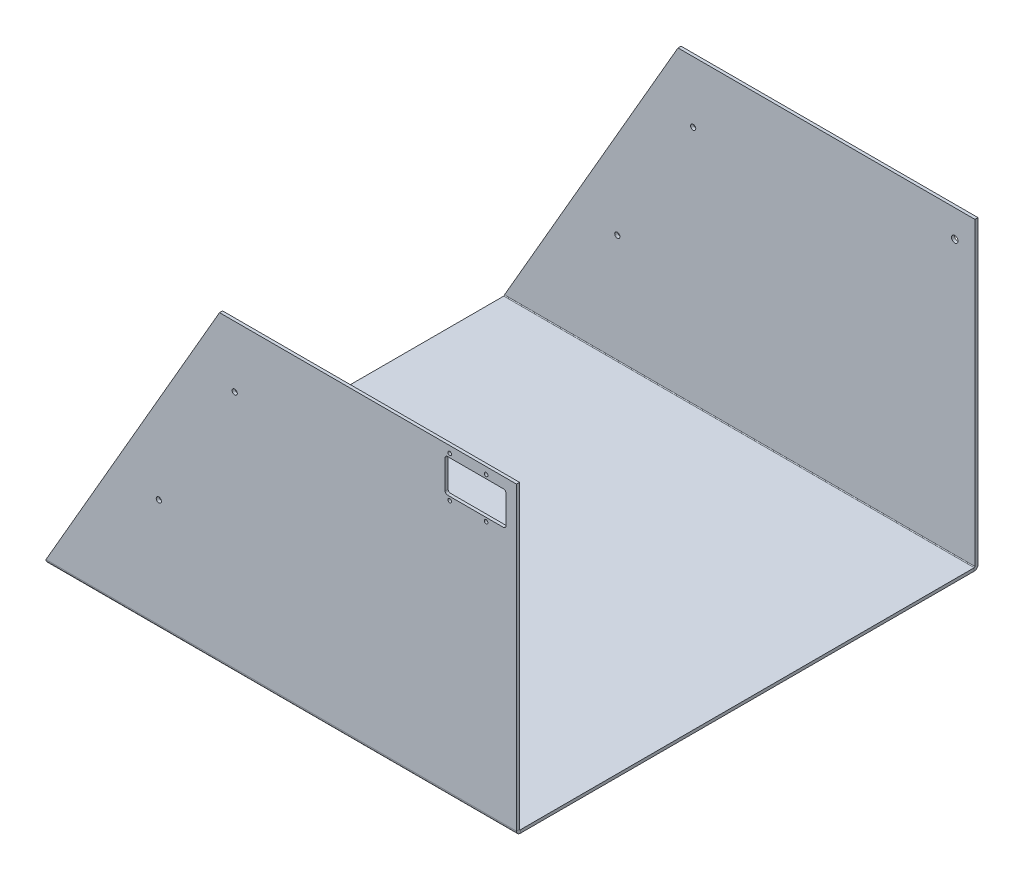
ISO-10303-21;
HEADER;
FILE_DESCRIPTION(('STEP AP214'),'2;1');
FILE_NAME('part.step','',(''),(''),'','','');
FILE_SCHEMA(('AUTOMOTIVE_DESIGN { 1 0 10303 214 1 1 1 1 }'));
ENDSEC;
DATA;
#1=APPLICATION_CONTEXT('core data for automotive mechanical design processes');
#2=APPLICATION_PROTOCOL_DEFINITION('international standard','automotive_design',2000,#1);
#3=PRODUCT_CONTEXT('',#1,'mechanical');
#4=PRODUCT('Part','Part','',(#3));
#5=PRODUCT_RELATED_PRODUCT_CATEGORY('part','',(#4));
#6=PRODUCT_DEFINITION_FORMATION('','',#4);
#7=PRODUCT_DEFINITION_CONTEXT('part definition',#1,'design');
#8=PRODUCT_DEFINITION('design','',#6,#7);
#9=PRODUCT_DEFINITION_SHAPE('','',#8);
#10=(LENGTH_UNIT() NAMED_UNIT(*) SI_UNIT(.MILLI.,.METRE.));
#11=(NAMED_UNIT(*) PLANE_ANGLE_UNIT() SI_UNIT($,.RADIAN.));
#12=(NAMED_UNIT(*) SI_UNIT($,.STERADIAN.) SOLID_ANGLE_UNIT());
#13=UNCERTAINTY_MEASURE_WITH_UNIT(LENGTH_MEASURE(1.E-05),#10,'distance_accuracy_value','');
#14=(GEOMETRIC_REPRESENTATION_CONTEXT(3) GLOBAL_UNCERTAINTY_ASSIGNED_CONTEXT((#13)) GLOBAL_UNIT_ASSIGNED_CONTEXT((#10,
#11,#12)) REPRESENTATION_CONTEXT('',''));
#15=CARTESIAN_POINT('',(0.,0.,0.));
#16=DIRECTION('',(0.,0.,1.));
#17=DIRECTION('',(1.,0.,0.));
#18=AXIS2_PLACEMENT_3D('',#15,#16,#17);
#19=CARTESIAN_POINT('',(0.,0.,-304.));
#20=DIRECTION('',(0.,0.,-1.));
#21=DIRECTION('',(-1.,0.,0.));
#22=AXIS2_PLACEMENT_3D('',#19,#20,#21);
#23=PLANE('',#22);
#24=CARTESIAN_POINT('',(-185.604770824935,157.726646048197,-304.));
#25=DIRECTION('',(0.,0.,-1.));
#26=DIRECTION('',(-1.,0.,0.));
#27=AXIS2_PLACEMENT_3D('',#24,#25,#26);
#28=CIRCLE('',#27,1.69999999999998);
#29=CARTESIAN_POINT('',(-187.304770824935,157.726646048197,-304.));
#30=VERTEX_POINT('',#29);
#31=EDGE_CURVE('E556',#30,#30,#28,.T.);
#32=ORIENTED_EDGE('',*,*,#31,.F.);
#33=EDGE_LOOP('',(#32));
#34=FACE_BOUND('',#33,.T.);
#35=CARTESIAN_POINT('',(-13.3,179.98217021338,-304.));
#36=DIRECTION('',(0.,0.,-1.));
#37=DIRECTION('',(-1.,0.,0.));
#38=AXIS2_PLACEMENT_3D('',#35,#36,#37);
#39=CIRCLE('',#38,2.14999999999999);
#40=CARTESIAN_POINT('',(-15.45,179.98217021338,-304.));
#41=VERTEX_POINT('',#40);
#42=EDGE_CURVE('E550',#41,#41,#39,.T.);
#43=ORIENTED_EDGE('',*,*,#42,.F.);
#44=EDGE_LOOP('',(#43));
#45=FACE_BOUND('',#44,.T.);
#46=CARTESIAN_POINT('',(-235.596855298411,71.1378157638619,-304.));
#47=DIRECTION('',(0.,0.,-1.));
#48=DIRECTION('',(-1.,0.,0.));
#49=AXIS2_PLACEMENT_3D('',#46,#47,#48);
#50=CIRCLE('',#49,1.69999999999998);
#51=CARTESIAN_POINT('',(-237.296855298411,71.1378157638619,-304.));
#52=VERTEX_POINT('',#51);
#53=EDGE_CURVE('E398',#52,#52,#50,.T.);
#54=ORIENTED_EDGE('',*,*,#53,.F.);
#55=EDGE_LOOP('',(#54));
#56=FACE_BOUND('',#55,.T.);
#57=DIRECTION('',(-1.,0.,0.));
#58=VECTOR('',#57,1.);
#59=CARTESIAN_POINT('',(0.,-1.04074594803853E-12,-304.));
#60=LINE('',#59,#58);
#61=CARTESIAN_POINT('',(0.,-1.05820335473276E-12,-304.));
#62=VERTEX_POINT('',#61);
#63=CARTESIAN_POINT('',(-309.908043231795,0.,-304.));
#64=VERTEX_POINT('',#63);
#65=EDGE_CURVE('E219',#62,#64,#60,.T.);
#66=ORIENTED_EDGE('',*,*,#65,.T.);
#67=DIRECTION('',(-0.500000000000004,-0.866025403784436,0.));
#68=VECTOR('',#67,1.);
#69=CARTESIAN_POINT('',(-309.908043231795,0.,-304.));
#70=LINE('',#69,#68);
#71=CARTESIAN_POINT('',(-195.602983964352,197.982170213382,-304.));
#72=VERTEX_POINT('',#71);
#73=EDGE_CURVE('E201',#72,#64,#70,.T.);
#74=ORIENTED_EDGE('',*,*,#73,.F.);
#75=DIRECTION('',(-1.,0.,0.));
#76=VECTOR('',#75,1.);
#77=CARTESIAN_POINT('',(0.,197.98217021338,-304.));
#78=LINE('',#77,#76);
#79=CARTESIAN_POINT('',(0.,197.98217021338,-304.));
#80=VERTEX_POINT('',#79);
#81=EDGE_CURVE('E211',#80,#72,#78,.T.);
#82=ORIENTED_EDGE('',*,*,#81,.F.);
#83=DIRECTION('',(0.,1.,0.));
#84=VECTOR('',#83,1.);
#85=CARTESIAN_POINT('',(0.,269.499999999999,-304.));
#86=LINE('',#85,#84);
#87=EDGE_CURVE('E235',#62,#80,#86,.T.);
#88=ORIENTED_EDGE('',*,*,#87,.F.);
#89=EDGE_LOOP('',(#66,#74,#82,#88));
#90=FACE_BOUND('',#89,.T.);
#91=ADVANCED_FACE('F60',(#34,#45,#56,#90),#23,.T.);
#92=CARTESIAN_POINT('',(0.,0.,-302.));
#93=DIRECTION('',(0.,0.,-1.));
#94=DIRECTION('',(-1.,0.,0.));
#95=AXIS2_PLACEMENT_3D('',#92,#93,#94);
#96=PLANE('',#95);
#97=CARTESIAN_POINT('',(-185.604770824935,157.726646048197,-302.));
#98=DIRECTION('',(0.,0.,-1.));
#99=DIRECTION('',(-1.,0.,0.));
#100=AXIS2_PLACEMENT_3D('',#97,#98,#99);
#101=CIRCLE('',#100,1.69999999999999);
#102=CARTESIAN_POINT('',(-187.304770824935,157.726646048197,-302.));
#103=VERTEX_POINT('',#102);
#104=EDGE_CURVE('E553',#103,#103,#101,.T.);
#105=ORIENTED_EDGE('',*,*,#104,.T.);
#106=EDGE_LOOP('',(#105));
#107=FACE_BOUND('',#106,.T.);
#108=CARTESIAN_POINT('',(-13.3,179.98217021338,-302.));
#109=DIRECTION('',(0.,0.,-1.));
#110=DIRECTION('',(-1.,0.,0.));
#111=AXIS2_PLACEMENT_3D('',#108,#109,#110);
#112=CIRCLE('',#111,2.14999999999999);
#113=CARTESIAN_POINT('',(-15.45,179.98217021338,-302.));
#114=VERTEX_POINT('',#113);
#115=EDGE_CURVE('E547',#114,#114,#112,.T.);
#116=ORIENTED_EDGE('',*,*,#115,.T.);
#117=EDGE_LOOP('',(#116));
#118=FACE_BOUND('',#117,.T.);
#119=CARTESIAN_POINT('',(-235.596855298411,71.1378157638619,-302.));
#120=DIRECTION('',(0.,0.,-1.));
#121=DIRECTION('',(-1.,0.,0.));
#122=AXIS2_PLACEMENT_3D('',#119,#120,#121);
#123=CIRCLE('',#122,1.69999999999999);
#124=CARTESIAN_POINT('',(-237.296855298411,71.1378157638619,-302.));
#125=VERTEX_POINT('',#124);
#126=EDGE_CURVE('E226',#125,#125,#123,.T.);
#127=ORIENTED_EDGE('',*,*,#126,.T.);
#128=EDGE_LOOP('',(#127));
#129=FACE_BOUND('',#128,.T.);
#130=DIRECTION('',(-0.500000000000004,-0.866025403784436,0.));
#131=VECTOR('',#130,1.);
#132=CARTESIAN_POINT('',(-309.908043231795,0.,-302.));
#133=LINE('',#132,#131);
#134=CARTESIAN_POINT('',(-195.602983964352,197.982170213382,-302.));
#135=VERTEX_POINT('',#134);
#136=CARTESIAN_POINT('',(-309.908043231795,0.,-302.));
#137=VERTEX_POINT('',#136);
#138=EDGE_CURVE('E204',#135,#137,#133,.T.);
#139=ORIENTED_EDGE('',*,*,#138,.T.);
#140=DIRECTION('',(-1.,0.,0.));
#141=VECTOR('',#140,1.);
#142=CARTESIAN_POINT('',(0.,-1.0547118733939E-12,-302.));
#143=LINE('',#142,#141);
#144=CARTESIAN_POINT('',(0.,-1.05820335473276E-12,-302.));
#145=VERTEX_POINT('',#144);
#146=EDGE_CURVE('E207',#145,#137,#143,.T.);
#147=ORIENTED_EDGE('',*,*,#146,.F.);
#148=DIRECTION('',(0.,1.,0.));
#149=VECTOR('',#148,1.);
#150=CARTESIAN_POINT('',(0.,269.499999999999,-302.));
#151=LINE('',#150,#149);
#152=CARTESIAN_POINT('',(0.,197.98217021338,-302.));
#153=VERTEX_POINT('',#152);
#154=EDGE_CURVE('E234',#145,#153,#151,.T.);
#155=ORIENTED_EDGE('',*,*,#154,.T.);
#156=DIRECTION('',(-1.,0.,0.));
#157=VECTOR('',#156,1.);
#158=CARTESIAN_POINT('',(0.,197.98217021338,-302.));
#159=LINE('',#158,#157);
#160=EDGE_CURVE('E224',#153,#135,#159,.T.);
#161=ORIENTED_EDGE('',*,*,#160,.T.);
#162=EDGE_LOOP('',(#139,#147,#155,#161));
#163=FACE_BOUND('',#162,.T.);
#164=ADVANCED_FACE('F403',(#107,#118,#129,#163),#96,.F.);
#165=CARTESIAN_POINT('',(-309.908043231795,-2.50000000000108,-302.));
#166=DIRECTION('',(1.,0.,0.));
#167=DIRECTION('',(0.,1.,0.));
#168=AXIS2_PLACEMENT_3D('',#165,#166,#167);
#169=PLANE('',#168);
#170=DIRECTION('',(0.,-1.,0.));
#171=VECTOR('',#170,1.);
#172=CARTESIAN_POINT('',(-309.908043231795,-0.500000000001114,-301.5));
#173=LINE('',#172,#171);
#174=CARTESIAN_POINT('',(-309.908043231795,-0.500000000001082,-301.5));
#175=VERTEX_POINT('',#174);
#176=CARTESIAN_POINT('',(-309.908043231795,-2.50000000000111,-301.5));
#177=VERTEX_POINT('',#176);
#178=EDGE_CURVE('E246',#175,#177,#173,.T.);
#179=ORIENTED_EDGE('',*,*,#178,.T.);
#180=DIRECTION('',(0.,0.,-1.));
#181=VECTOR('',#180,1.);
#182=CARTESIAN_POINT('',(-309.908043231795,-2.50000000000003,0.));
#183=LINE('',#182,#181);
#184=CARTESIAN_POINT('',(-309.908043231795,-2.50000000000004,-2.49999999999998));
#185=VERTEX_POINT('',#184);
#186=EDGE_CURVE('E265',#185,#177,#183,.T.);
#187=ORIENTED_EDGE('',*,*,#186,.F.);
#188=DIRECTION('',(0.,1.,0.));
#189=VECTOR('',#188,1.);
#190=CARTESIAN_POINT('',(-309.908043231795,-0.500000000000038,-2.49999999999999));
#191=LINE('',#190,#189);
#192=CARTESIAN_POINT('',(-309.908043231795,-0.500000000000067,-2.49999999999999));
#193=VERTEX_POINT('',#192);
#194=EDGE_CURVE('E275',#193,#185,#191,.F.);
#195=ORIENTED_EDGE('',*,*,#194,.F.);
#196=DIRECTION('',(0.,0.,1.));
#197=VECTOR('',#196,1.);
#198=CARTESIAN_POINT('',(-309.908043231795,-0.500000000001084,-302.));
#199=LINE('',#198,#197);
#200=EDGE_CURVE('E269',#193,#175,#199,.F.);
#201=ORIENTED_EDGE('',*,*,#200,.T.);
#202=EDGE_LOOP('',(#179,#187,#195,#201));
#203=FACE_BOUND('',#202,.T.);
#204=ADVANCED_FACE('F419',(#203),#169,.F.);
#205=CARTESIAN_POINT('',(0.,-2.5,-1.99999999999999));
#206=DIRECTION('',(-1.,0.,0.));
#207=DIRECTION('',(0.,-1.,0.));
#208=AXIS2_PLACEMENT_3D('',#205,#206,#207);
#209=PLANE('',#208);
#210=DIRECTION('',(0.,-1.,0.));
#211=VECTOR('',#210,1.);
#212=CARTESIAN_POINT('',(0.,-0.500000000001059,-301.5));
#213=LINE('',#212,#211);
#214=CARTESIAN_POINT('',(0.,-0.500000000001059,-301.5));
#215=VERTEX_POINT('',#214);
#216=CARTESIAN_POINT('',(0.,-2.50000000000104,-301.5));
#217=VERTEX_POINT('',#216);
#218=EDGE_CURVE('E256',#215,#217,#213,.T.);
#219=ORIENTED_EDGE('',*,*,#218,.F.);
#220=DIRECTION('',(0.,0.,-1.));
#221=VECTOR('',#220,1.);
#222=CARTESIAN_POINT('',(0.,-0.499999999999998,-2.));
#223=LINE('',#222,#221);
#224=CARTESIAN_POINT('',(0.,-0.5,-2.49999999999999));
#225=VERTEX_POINT('',#224);
#226=EDGE_CURVE('E267',#215,#225,#223,.F.);
#227=ORIENTED_EDGE('',*,*,#226,.T.);
#228=DIRECTION('',(0.,1.,0.));
#229=VECTOR('',#228,1.);
#230=CARTESIAN_POINT('',(0.,-2.5,-2.49999999999999));
#231=LINE('',#230,#229);
#232=CARTESIAN_POINT('',(0.,-2.5,-2.49999999999999));
#233=VERTEX_POINT('',#232);
#234=EDGE_CURVE('E259',#225,#233,#231,.F.);
#235=ORIENTED_EDGE('',*,*,#234,.T.);
#236=DIRECTION('',(0.,0.,1.));
#237=VECTOR('',#236,1.);
#238=CARTESIAN_POINT('',(0.,-2.49999999999999,0.));
#239=LINE('',#238,#237);
#240=EDGE_CURVE('E262',#217,#233,#239,.T.);
#241=ORIENTED_EDGE('',*,*,#240,.F.);
#242=EDGE_LOOP('',(#219,#227,#235,#241));
#243=FACE_BOUND('',#242,.T.);
#244=ADVANCED_FACE('F448',(#243),#209,.F.);
#245=CARTESIAN_POINT('',(0.,-2.49999999999999,0.));
#246=DIRECTION('',(0.,1.,0.));
#247=DIRECTION('',(0.,0.,1.));
#248=AXIS2_PLACEMENT_3D('',#245,#246,#247);
#249=PLANE('',#248);
#250=DIRECTION('',(-1.,0.,0.));
#251=VECTOR('',#250,1.);
#252=CARTESIAN_POINT('',(-309.908043231795,-2.50000000000111,-301.5));
#253=LINE('',#252,#251);
#254=EDGE_CURVE('E240',#177,#217,#253,.F.);
#255=ORIENTED_EDGE('',*,*,#254,.T.);
#256=ORIENTED_EDGE('',*,*,#240,.T.);
#257=DIRECTION('',(-1.,0.,0.));
#258=VECTOR('',#257,1.);
#259=CARTESIAN_POINT('',(0.,-2.5,-2.49999999999999));
#260=LINE('',#259,#258);
#261=EDGE_CURVE('E272',#185,#233,#260,.F.);
#262=ORIENTED_EDGE('',*,*,#261,.F.);
#263=ORIENTED_EDGE('',*,*,#186,.T.);
#264=EDGE_LOOP('',(#255,#256,#262,#263));
#265=FACE_BOUND('',#264,.T.);
#266=ADVANCED_FACE('F444',(#265),#249,.F.);
#267=CARTESIAN_POINT('',(0.,-0.499999999999991,0.));
#268=DIRECTION('',(0.,1.,0.));
#269=DIRECTION('',(0.,0.,1.));
#270=AXIS2_PLACEMENT_3D('',#267,#268,#269);
#271=PLANE('',#270);
#272=ORIENTED_EDGE('',*,*,#226,.F.);
#273=DIRECTION('',(-1.,0.,0.));
#274=VECTOR('',#273,1.);
#275=CARTESIAN_POINT('',(-309.908043231795,-0.500000000001114,-301.5));
#276=LINE('',#275,#274);
#277=EDGE_CURVE('E251',#175,#215,#276,.F.);
#278=ORIENTED_EDGE('',*,*,#277,.F.);
#279=ORIENTED_EDGE('',*,*,#200,.F.);
#280=DIRECTION('',(-1.,0.,0.));
#281=VECTOR('',#280,1.);
#282=CARTESIAN_POINT('',(0.,-0.5,-2.5));
#283=LINE('',#282,#281);
#284=EDGE_CURVE('E278',#225,#193,#283,.T.);
#285=ORIENTED_EDGE('',*,*,#284,.F.);
#286=EDGE_LOOP('',(#272,#278,#279,#285));
#287=FACE_BOUND('',#286,.T.);
#288=ADVANCED_FACE('F447',(#287),#271,.T.);
#289=CARTESIAN_POINT('',(0.,0.,-2.));
#290=DIRECTION('',(1.,0.,0.));
#291=DIRECTION('',(0.,1.,0.));
#292=AXIS2_PLACEMENT_3D('',#289,#290,#291);
#293=PLANE('',#292);
#294=DIRECTION('',(0.,1.,0.));
#295=VECTOR('',#294,1.);
#296=CARTESIAN_POINT('',(0.,0.,0.));
#297=LINE('',#296,#295);
#298=CARTESIAN_POINT('',(0.,0.,0.));
#299=VERTEX_POINT('',#298);
#300=CARTESIAN_POINT('',(0.,197.98217021338,0.));
#301=VERTEX_POINT('',#300);
#302=EDGE_CURVE('E285',#299,#301,#297,.T.);
#303=ORIENTED_EDGE('',*,*,#302,.F.);
#304=DIRECTION('',(0.,0.,1.));
#305=VECTOR('',#304,1.);
#306=CARTESIAN_POINT('',(0.,0.,-2.));
#307=LINE('',#306,#305);
#308=CARTESIAN_POINT('',(0.,0.,-1.99999999999998));
#309=VERTEX_POINT('',#308);
#310=EDGE_CURVE('E317',#309,#299,#307,.T.);
#311=ORIENTED_EDGE('',*,*,#310,.F.);
#312=DIRECTION('',(0.,1.,0.));
#313=VECTOR('',#312,1.);
#314=CARTESIAN_POINT('',(0.,0.,-2.));
#315=LINE('',#314,#313);
#316=CARTESIAN_POINT('',(0.,197.98217021338,-2.));
#317=VERTEX_POINT('',#316);
#318=EDGE_CURVE('E294',#309,#317,#315,.T.);
#319=ORIENTED_EDGE('',*,*,#318,.T.);
#320=DIRECTION('',(0.,0.,1.));
#321=VECTOR('',#320,1.);
#322=CARTESIAN_POINT('',(0.,197.98217021338,-2.));
#323=LINE('',#322,#321);
#324=EDGE_CURVE('E306',#317,#301,#323,.T.);
#325=ORIENTED_EDGE('',*,*,#324,.T.);
#326=EDGE_LOOP('',(#303,#311,#319,#325));
#327=FACE_BOUND('',#326,.T.);
#328=ADVANCED_FACE('F452',(#327),#293,.T.);
#329=CARTESIAN_POINT('',(-309.908043231795,0.,-2.));
#330=DIRECTION('',(-0.866025403784436,0.500000000000004,0.));
#331=DIRECTION('',(-0.500000000000004,-0.866025403784436,0.));
#332=AXIS2_PLACEMENT_3D('',#329,#330,#331);
#333=PLANE('',#332);
#334=DIRECTION('',(-0.500000000000004,-0.866025403784436,0.));
#335=VECTOR('',#334,1.);
#336=CARTESIAN_POINT('',(-309.908043231795,0.,0.));
#337=LINE('',#336,#335);
#338=CARTESIAN_POINT('',(-195.602983964353,197.98217021338,0.));
#339=VERTEX_POINT('',#338);
#340=CARTESIAN_POINT('',(-309.908043231795,0.,0.));
#341=VERTEX_POINT('',#340);
#342=EDGE_CURVE('E312',#339,#341,#337,.T.);
#343=ORIENTED_EDGE('',*,*,#342,.F.);
#344=DIRECTION('',(0.,0.,1.));
#345=VECTOR('',#344,1.);
#346=CARTESIAN_POINT('',(-195.602983964353,197.98217021338,-2.));
#347=LINE('',#346,#345);
#348=CARTESIAN_POINT('',(-195.602983964353,197.98217021338,-2.));
#349=VERTEX_POINT('',#348);
#350=EDGE_CURVE('E324',#349,#339,#347,.T.);
#351=ORIENTED_EDGE('',*,*,#350,.F.);
#352=DIRECTION('',(-0.500000000000004,-0.866025403784436,0.));
#353=VECTOR('',#352,1.);
#354=CARTESIAN_POINT('',(-309.908043231795,0.,-2.));
#355=LINE('',#354,#353);
#356=CARTESIAN_POINT('',(-309.908043231795,0.,-1.99999999999998));
#357=VERTEX_POINT('',#356);
#358=EDGE_CURVE('E301',#349,#357,#355,.T.);
#359=ORIENTED_EDGE('',*,*,#358,.T.);
#360=DIRECTION('',(0.,0.,1.));
#361=VECTOR('',#360,1.);
#362=CARTESIAN_POINT('',(-309.908043231795,0.,-2.));
#363=LINE('',#362,#361);
#364=EDGE_CURVE('E321',#357,#341,#363,.T.);
#365=ORIENTED_EDGE('',*,*,#364,.T.);
#366=EDGE_LOOP('',(#343,#351,#359,#365));
#367=FACE_BOUND('',#366,.T.);
#368=ADVANCED_FACE('F482',(#367),#333,.T.);
#369=CARTESIAN_POINT('',(0.,197.98217021338,-2.));
#370=DIRECTION('',(0.,1.,0.));
#371=DIRECTION('',(-1.,0.,0.));
#372=AXIS2_PLACEMENT_3D('',#369,#370,#371);
#373=PLANE('',#372);
#374=DIRECTION('',(-1.,0.,0.));
#375=VECTOR('',#374,1.);
#376=CARTESIAN_POINT('',(0.,197.98217021338,0.));
#377=LINE('',#376,#375);
#378=EDGE_CURVE('E309',#301,#339,#377,.T.);
#379=ORIENTED_EDGE('',*,*,#378,.F.);
#380=ORIENTED_EDGE('',*,*,#324,.F.);
#381=DIRECTION('',(-1.,0.,0.));
#382=VECTOR('',#381,1.);
#383=CARTESIAN_POINT('',(0.,197.98217021338,-2.));
#384=LINE('',#383,#382);
#385=EDGE_CURVE('E297',#317,#349,#384,.T.);
#386=ORIENTED_EDGE('',*,*,#385,.T.);
#387=ORIENTED_EDGE('',*,*,#350,.T.);
#388=EDGE_LOOP('',(#379,#380,#386,#387));
#389=FACE_BOUND('',#388,.T.);
#390=ADVANCED_FACE('F477',(#389),#373,.T.);
#391=CARTESIAN_POINT('',(0.,0.,-2.));
#392=DIRECTION('',(0.,0.,1.));
#393=DIRECTION('',(1.,0.,0.));
#394=AXIS2_PLACEMENT_3D('',#391,#392,#393);
#395=PLANE('',#394);
#396=CARTESIAN_POINT('',(-185.604770824935,157.726646048197,-2.));
#397=DIRECTION('',(0.,0.,1.));
#398=DIRECTION('',(1.,0.,0.));
#399=AXIS2_PLACEMENT_3D('',#396,#397,#398);
#400=CIRCLE('',#399,1.69999999999999);
#401=CARTESIAN_POINT('',(-183.904770824935,157.726646048197,-2.));
#402=VERTEX_POINT('',#401);
#403=EDGE_CURVE('E559',#402,#402,#400,.T.);
#404=ORIENTED_EDGE('',*,*,#403,.T.);
#405=EDGE_LOOP('',(#404));
#406=FACE_BOUND('',#405,.T.);
#407=CARTESIAN_POINT('',(-44.,166.48217021338,-2.));
#408=DIRECTION('',(0.,0.,1.));
#409=DIRECTION('',(1.,0.,0.));
#410=AXIS2_PLACEMENT_3D('',#407,#408,#409);
#411=CIRCLE('',#410,1.2);
#412=CARTESIAN_POINT('',(-42.8,166.48217021338,-2.));
#413=VERTEX_POINT('',#412);
#414=EDGE_CURVE('E541',#413,#413,#411,.T.);
#415=ORIENTED_EDGE('',*,*,#414,.T.);
#416=EDGE_LOOP('',(#415));
#417=FACE_BOUND('',#416,.T.);
#418=CARTESIAN_POINT('',(-44.,193.48217021338,-2.));
#419=DIRECTION('',(0.,0.,1.));
#420=DIRECTION('',(1.,0.,0.));
#421=AXIS2_PLACEMENT_3D('',#418,#419,#420);
#422=CIRCLE('',#421,1.20000000000001);
#423=CARTESIAN_POINT('',(-42.8,193.48217021338,-2.));
#424=VERTEX_POINT('',#423);
#425=EDGE_CURVE('E535',#424,#424,#422,.T.);
#426=ORIENTED_EDGE('',*,*,#425,.T.);
#427=EDGE_LOOP('',(#426));
#428=FACE_BOUND('',#427,.T.);
#429=CARTESIAN_POINT('',(-19.9999999999999,166.48217021338,-2.));
#430=DIRECTION('',(0.,0.,1.));
#431=DIRECTION('',(1.,0.,0.));
#432=AXIS2_PLACEMENT_3D('',#429,#430,#431);
#433=CIRCLE('',#432,1.20000000000002);
#434=CARTESIAN_POINT('',(-18.7999999999999,166.48217021338,-2.));
#435=VERTEX_POINT('',#434);
#436=EDGE_CURVE('E528',#435,#435,#433,.T.);
#437=ORIENTED_EDGE('',*,*,#436,.T.);
#438=EDGE_LOOP('',(#437));
#439=FACE_BOUND('',#438,.T.);
#440=DIRECTION('',(0.,1.,0.));
#441=VECTOR('',#440,1.);
#442=CARTESIAN_POINT('',(-6.99999999999999,0.,-2.));
#443=LINE('',#442,#441);
#444=CARTESIAN_POINT('',(-6.99999999999999,170.48217021338,-2.));
#445=VERTEX_POINT('',#444);
#446=CARTESIAN_POINT('',(-6.99999999999999,189.48217021338,-2.));
#447=VERTEX_POINT('',#446);
#448=EDGE_CURVE('E386',#445,#447,#443,.T.);
#449=ORIENTED_EDGE('',*,*,#448,.T.);
#450=CARTESIAN_POINT('',(-8.49999999999999,189.48217021338,-2.));
#451=DIRECTION('',(0.,0.,1.));
#452=DIRECTION('',(1.,0.,0.));
#453=AXIS2_PLACEMENT_3D('',#450,#451,#452);
#454=CIRCLE('',#453,1.5);
#455=CARTESIAN_POINT('',(-8.49999999999999,190.98217021338,-2.));
#456=VERTEX_POINT('',#455);
#457=EDGE_CURVE('E82',#447,#456,#454,.T.);
#458=ORIENTED_EDGE('',*,*,#457,.T.);
#459=DIRECTION('',(-1.,0.,0.));
#460=VECTOR('',#459,1.);
#461=CARTESIAN_POINT('',(0.,190.98217021338,-2.));
#462=LINE('',#461,#460);
#463=CARTESIAN_POINT('',(-45.5,190.98217021338,-2.));
#464=VERTEX_POINT('',#463);
#465=EDGE_CURVE('E377',#456,#464,#462,.T.);
#466=ORIENTED_EDGE('',*,*,#465,.T.);
#467=CARTESIAN_POINT('',(-45.5,189.48217021338,-2.));
#468=DIRECTION('',(0.,0.,1.));
#469=DIRECTION('',(1.,0.,0.));
#470=AXIS2_PLACEMENT_3D('',#467,#468,#469);
#471=CIRCLE('',#470,1.5);
#472=CARTESIAN_POINT('',(-47.,189.48217021338,-2.));
#473=VERTEX_POINT('',#472);
#474=EDGE_CURVE('E14',#464,#473,#471,.T.);
#475=ORIENTED_EDGE('',*,*,#474,.T.);
#476=DIRECTION('',(0.,-1.,0.));
#477=VECTOR('',#476,1.);
#478=CARTESIAN_POINT('',(-47.,0.,-2.));
#479=LINE('',#478,#477);
#480=CARTESIAN_POINT('',(-47.,170.48217021338,-2.));
#481=VERTEX_POINT('',#480);
#482=EDGE_CURVE('E375',#473,#481,#479,.T.);
#483=ORIENTED_EDGE('',*,*,#482,.T.);
#484=CARTESIAN_POINT('',(-45.5,170.48217021338,-2.));
#485=DIRECTION('',(0.,0.,1.));
#486=DIRECTION('',(1.,0.,0.));
#487=AXIS2_PLACEMENT_3D('',#484,#485,#486);
#488=CIRCLE('',#487,1.5);
#489=CARTESIAN_POINT('',(-45.5,168.98217021338,-2.));
#490=VERTEX_POINT('',#489);
#491=EDGE_CURVE('E351',#481,#490,#488,.T.);
#492=ORIENTED_EDGE('',*,*,#491,.T.);
#493=DIRECTION('',(1.,0.,0.));
#494=VECTOR('',#493,1.);
#495=CARTESIAN_POINT('',(0.,168.98217021338,-2.));
#496=LINE('',#495,#494);
#497=CARTESIAN_POINT('',(-8.49999999999999,168.98217021338,-2.));
#498=VERTEX_POINT('',#497);
#499=EDGE_CURVE('E367',#490,#498,#496,.T.);
#500=ORIENTED_EDGE('',*,*,#499,.T.);
#501=CARTESIAN_POINT('',(-8.49999999999999,170.48217021338,-2.));
#502=DIRECTION('',(0.,0.,1.));
#503=DIRECTION('',(1.,0.,0.));
#504=AXIS2_PLACEMENT_3D('',#501,#502,#503);
#505=CIRCLE('',#504,1.5);
#506=EDGE_CURVE('E347',#498,#445,#505,.T.);
#507=ORIENTED_EDGE('',*,*,#506,.T.);
#508=EDGE_LOOP('',(#449,#458,#466,#475,#483,#492,#500,#507));
#509=FACE_BOUND('',#508,.T.);
#510=CARTESIAN_POINT('',(-20.,193.48217021338,-2.));
#511=DIRECTION('',(0.,0.,1.));
#512=DIRECTION('',(1.,0.,0.));
#513=AXIS2_PLACEMENT_3D('',#510,#511,#512);
#514=CIRCLE('',#513,1.19999999999995);
#515=CARTESIAN_POINT('',(-18.8,193.48217021338,-2.));
#516=VERTEX_POINT('',#515);
#517=EDGE_CURVE('E384',#516,#516,#514,.T.);
#518=ORIENTED_EDGE('',*,*,#517,.T.);
#519=EDGE_LOOP('',(#518));
#520=FACE_BOUND('',#519,.T.);
#521=CARTESIAN_POINT('',(-235.596855298411,71.1378157638619,-2.));
#522=DIRECTION('',(0.,0.,1.));
#523=DIRECTION('',(1.,0.,0.));
#524=AXIS2_PLACEMENT_3D('',#521,#522,#523);
#525=CIRCLE('',#524,1.69999999999999);
#526=CARTESIAN_POINT('',(-233.896855298411,71.1378157638619,-2.));
#527=VERTEX_POINT('',#526);
#528=EDGE_CURVE('E395',#527,#527,#525,.T.);
#529=ORIENTED_EDGE('',*,*,#528,.T.);
#530=EDGE_LOOP('',(#529));
#531=FACE_BOUND('',#530,.T.);
#532=ORIENTED_EDGE('',*,*,#318,.F.);
#533=DIRECTION('',(1.,0.,0.));
#534=VECTOR('',#533,1.);
#535=CARTESIAN_POINT('',(0.,0.,-2.));
#536=LINE('',#535,#534);
#537=EDGE_CURVE('E304',#357,#309,#536,.T.);
#538=ORIENTED_EDGE('',*,*,#537,.F.);
#539=ORIENTED_EDGE('',*,*,#358,.F.);
#540=ORIENTED_EDGE('',*,*,#385,.F.);
#541=EDGE_LOOP('',(#532,#538,#539,#540));
#542=FACE_BOUND('',#541,.T.);
#543=ADVANCED_FACE('F373',(#406,#417,#428,#439,#509,#520,#531,#542),#395,.F.);
#544=CARTESIAN_POINT('',(0.,0.,0.));
#545=DIRECTION('',(0.,0.,1.));
#546=DIRECTION('',(1.,0.,0.));
#547=AXIS2_PLACEMENT_3D('',#544,#545,#546);
#548=PLANE('',#547);
#549=CARTESIAN_POINT('',(-185.604770824935,157.726646048197,0.));
#550=DIRECTION('',(0.,0.,1.));
#551=DIRECTION('',(1.,0.,0.));
#552=AXIS2_PLACEMENT_3D('',#549,#550,#551);
#553=CIRCLE('',#552,1.69999999999998);
#554=CARTESIAN_POINT('',(-183.904770824935,157.726646048197,0.));
#555=VERTEX_POINT('',#554);
#556=EDGE_CURVE('E562',#555,#555,#553,.T.);
#557=ORIENTED_EDGE('',*,*,#556,.F.);
#558=EDGE_LOOP('',(#557));
#559=FACE_BOUND('',#558,.T.);
#560=CARTESIAN_POINT('',(-44.,166.48217021338,0.));
#561=DIRECTION('',(0.,0.,1.));
#562=DIRECTION('',(-1.,0.,0.));
#563=AXIS2_PLACEMENT_3D('',#560,#561,#562);
#564=CIRCLE('',#563,1.2);
#565=CARTESIAN_POINT('',(-45.2,166.48217021338,0.));
#566=VERTEX_POINT('',#565);
#567=EDGE_CURVE('E544',#566,#566,#564,.T.);
#568=ORIENTED_EDGE('',*,*,#567,.F.);
#569=EDGE_LOOP('',(#568));
#570=FACE_BOUND('',#569,.T.);
#571=CARTESIAN_POINT('',(-44.,193.48217021338,0.));
#572=DIRECTION('',(0.,0.,1.));
#573=DIRECTION('',(1.,0.,0.));
#574=AXIS2_PLACEMENT_3D('',#571,#572,#573);
#575=CIRCLE('',#574,1.20000000000001);
#576=CARTESIAN_POINT('',(-42.8,193.48217021338,0.));
#577=VERTEX_POINT('',#576);
#578=EDGE_CURVE('E538',#577,#577,#575,.T.);
#579=ORIENTED_EDGE('',*,*,#578,.F.);
#580=EDGE_LOOP('',(#579));
#581=FACE_BOUND('',#580,.T.);
#582=CARTESIAN_POINT('',(-19.9999999999999,166.48217021338,0.));
#583=DIRECTION('',(0.,0.,1.));
#584=DIRECTION('',(-1.,0.,0.));
#585=AXIS2_PLACEMENT_3D('',#582,#583,#584);
#586=CIRCLE('',#585,1.20000000000002);
#587=CARTESIAN_POINT('',(-21.2,166.48217021338,0.));
#588=VERTEX_POINT('',#587);
#589=EDGE_CURVE('E530',#588,#588,#586,.T.);
#590=ORIENTED_EDGE('',*,*,#589,.F.);
#591=EDGE_LOOP('',(#590));
#592=FACE_BOUND('',#591,.T.);
#593=DIRECTION('',(0.,-1.,0.));
#594=VECTOR('',#593,1.);
#595=CARTESIAN_POINT('',(-47.,190.98217021338,0.));
#596=LINE('',#595,#594);
#597=CARTESIAN_POINT('',(-47.,189.48217021338,0.));
#598=VERTEX_POINT('',#597);
#599=CARTESIAN_POINT('',(-47.,170.48217021338,0.));
#600=VERTEX_POINT('',#599);
#601=EDGE_CURVE('E362',#598,#600,#596,.T.);
#602=ORIENTED_EDGE('',*,*,#601,.F.);
#603=CARTESIAN_POINT('',(-45.5,189.48217021338,0.));
#604=DIRECTION('',(0.,0.,1.));
#605=DIRECTION('',(1.,0.,0.));
#606=AXIS2_PLACEMENT_3D('',#603,#604,#605);
#607=CIRCLE('',#606,1.5);
#608=CARTESIAN_POINT('',(-45.5,190.98217021338,0.));
#609=VERTEX_POINT('',#608);
#610=EDGE_CURVE('E68',#598,#609,#607,.F.);
#611=ORIENTED_EDGE('',*,*,#610,.T.);
#612=DIRECTION('',(-1.,0.,0.));
#613=VECTOR('',#612,1.);
#614=CARTESIAN_POINT('',(-47.,190.98217021338,0.));
#615=LINE('',#614,#613);
#616=CARTESIAN_POINT('',(-8.49999999999999,190.98217021338,0.));
#617=VERTEX_POINT('',#616);
#618=EDGE_CURVE('E360',#617,#609,#615,.T.);
#619=ORIENTED_EDGE('',*,*,#618,.F.);
#620=CARTESIAN_POINT('',(-8.49999999999999,189.48217021338,0.));
#621=DIRECTION('',(0.,0.,1.));
#622=DIRECTION('',(1.,0.,0.));
#623=AXIS2_PLACEMENT_3D('',#620,#621,#622);
#624=CIRCLE('',#623,1.5);
#625=CARTESIAN_POINT('',(-6.99999999999999,189.48217021338,0.));
#626=VERTEX_POINT('',#625);
#627=EDGE_CURVE('E353',#617,#626,#624,.F.);
#628=ORIENTED_EDGE('',*,*,#627,.T.);
#629=DIRECTION('',(0.,1.,0.));
#630=VECTOR('',#629,1.);
#631=CARTESIAN_POINT('',(-6.99999999999999,190.98217021338,0.));
#632=LINE('',#631,#630);
#633=CARTESIAN_POINT('',(-6.99999999999999,170.48217021338,0.));
#634=VERTEX_POINT('',#633);
#635=EDGE_CURVE('E368',#634,#626,#632,.T.);
#636=ORIENTED_EDGE('',*,*,#635,.F.);
#637=CARTESIAN_POINT('',(-8.49999999999999,170.48217021338,0.));
#638=DIRECTION('',(0.,0.,1.));
#639=DIRECTION('',(1.,0.,0.));
#640=AXIS2_PLACEMENT_3D('',#637,#638,#639);
#641=CIRCLE('',#640,1.5);
#642=CARTESIAN_POINT('',(-8.49999999999999,168.98217021338,0.));
#643=VERTEX_POINT('',#642);
#644=EDGE_CURVE('E345',#634,#643,#641,.F.);
#645=ORIENTED_EDGE('',*,*,#644,.T.);
#646=DIRECTION('',(1.,0.,0.));
#647=VECTOR('',#646,1.);
#648=CARTESIAN_POINT('',(-47.,168.98217021338,0.));
#649=LINE('',#648,#647);
#650=CARTESIAN_POINT('',(-45.5,168.98217021338,0.));
#651=VERTEX_POINT('',#650);
#652=EDGE_CURVE('E514',#651,#643,#649,.T.);
#653=ORIENTED_EDGE('',*,*,#652,.F.);
#654=CARTESIAN_POINT('',(-45.5,170.48217021338,0.));
#655=DIRECTION('',(0.,0.,1.));
#656=DIRECTION('',(1.,0.,0.));
#657=AXIS2_PLACEMENT_3D('',#654,#655,#656);
#658=CIRCLE('',#657,1.5);
#659=EDGE_CURVE('E349',#651,#600,#658,.F.);
#660=ORIENTED_EDGE('',*,*,#659,.T.);
#661=EDGE_LOOP('',(#602,#611,#619,#628,#636,#645,#653,#660));
#662=FACE_BOUND('',#661,.T.);
#663=CARTESIAN_POINT('',(-20.,193.48217021338,0.));
#664=DIRECTION('',(0.,0.,1.));
#665=DIRECTION('',(1.,0.,0.));
#666=AXIS2_PLACEMENT_3D('',#663,#664,#665);
#667=CIRCLE('',#666,1.19999999999995);
#668=CARTESIAN_POINT('',(-18.8,193.48217021338,0.));
#669=VERTEX_POINT('',#668);
#670=EDGE_CURVE('E381',#669,#669,#667,.T.);
#671=ORIENTED_EDGE('',*,*,#670,.F.);
#672=EDGE_LOOP('',(#671));
#673=FACE_BOUND('',#672,.T.);
#674=CARTESIAN_POINT('',(-235.596855298411,71.1378157638619,0.));
#675=DIRECTION('',(0.,0.,1.));
#676=DIRECTION('',(1.,0.,0.));
#677=AXIS2_PLACEMENT_3D('',#674,#675,#676);
#678=CIRCLE('',#677,1.69999999999998);
#679=CARTESIAN_POINT('',(-233.896855298411,71.1378157638619,0.));
#680=VERTEX_POINT('',#679);
#681=EDGE_CURVE('E392',#680,#680,#678,.T.);
#682=ORIENTED_EDGE('',*,*,#681,.F.);
#683=EDGE_LOOP('',(#682));
#684=FACE_BOUND('',#683,.T.);
#685=ORIENTED_EDGE('',*,*,#302,.T.);
#686=ORIENTED_EDGE('',*,*,#378,.T.);
#687=ORIENTED_EDGE('',*,*,#342,.T.);
#688=DIRECTION('',(1.,0.,0.));
#689=VECTOR('',#688,1.);
#690=CARTESIAN_POINT('',(0.,0.,0.));
#691=LINE('',#690,#689);
#692=EDGE_CURVE('E298',#341,#299,#691,.T.);
#693=ORIENTED_EDGE('',*,*,#692,.T.);
#694=EDGE_LOOP('',(#685,#686,#687,#693));
#695=FACE_BOUND('',#694,.T.);
#696=ADVANCED_FACE('F358',(#559,#570,#581,#592,#662,#673,#684,#695),#548,.T.);
#697=CARTESIAN_POINT('',(0.,0.,-2.49999999999999));
#698=DIRECTION('',(1.,0.,0.));
#699=DIRECTION('',(0.,1.,0.));
#700=AXIS2_PLACEMENT_3D('',#697,#698,#699);
#701=PLANE('',#700);
#702=ORIENTED_EDGE('',*,*,#234,.F.);
#703=CARTESIAN_POINT('',(0.,0.,-2.49999999999999));
#704=DIRECTION('',(-1.,0.,0.));
#705=DIRECTION('',(0.,-1.,0.));
#706=AXIS2_PLACEMENT_3D('',#703,#704,#705);
#707=CIRCLE('',#706,0.500000000000015);
#708=EDGE_CURVE('E289',#309,#225,#707,.F.);
#709=ORIENTED_EDGE('',*,*,#708,.F.);
#710=ORIENTED_EDGE('',*,*,#310,.T.);
#711=CARTESIAN_POINT('',(0.,0.,-2.49999999999999));
#712=DIRECTION('',(-1.,0.,0.));
#713=DIRECTION('',(0.,-1.,0.));
#714=AXIS2_PLACEMENT_3D('',#711,#712,#713);
#715=CIRCLE('',#714,2.50000000000001);
#716=EDGE_CURVE('E282',#299,#233,#715,.F.);
#717=ORIENTED_EDGE('',*,*,#716,.T.);
#718=EDGE_LOOP('',(#702,#709,#710,#717));
#719=FACE_BOUND('',#718,.T.);
#720=ADVANCED_FACE('F468',(#719),#701,.T.);
#721=CARTESIAN_POINT('',(-309.908043231795,0.,-2.49999999999999));
#722=DIRECTION('',(1.,0.,0.));
#723=DIRECTION('',(0.,1.,0.));
#724=AXIS2_PLACEMENT_3D('',#721,#722,#723);
#725=PLANE('',#724);
#726=CARTESIAN_POINT('',(-309.908043231795,0.,-2.49999999999999));
#727=DIRECTION('',(-1.,0.,0.));
#728=DIRECTION('',(0.,-1.,0.));
#729=AXIS2_PLACEMENT_3D('',#726,#727,#728);
#730=CIRCLE('',#729,0.500000000000015);
#731=EDGE_CURVE('E264',#193,#357,#730,.T.);
#732=ORIENTED_EDGE('',*,*,#731,.F.);
#733=ORIENTED_EDGE('',*,*,#194,.T.);
#734=CARTESIAN_POINT('',(-309.908043231795,0.,-2.49999999999999));
#735=DIRECTION('',(-1.,0.,0.));
#736=DIRECTION('',(0.,-1.,0.));
#737=AXIS2_PLACEMENT_3D('',#734,#735,#736);
#738=CIRCLE('',#737,2.50000000000001);
#739=EDGE_CURVE('E286',#185,#341,#738,.T.);
#740=ORIENTED_EDGE('',*,*,#739,.T.);
#741=ORIENTED_EDGE('',*,*,#364,.F.);
#742=EDGE_LOOP('',(#732,#733,#740,#741));
#743=FACE_BOUND('',#742,.T.);
#744=ADVANCED_FACE('F463',(#743),#725,.F.);
#745=CARTESIAN_POINT('',(-309.908043231795,0.,-2.49999999999999));
#746=DIRECTION('',(-1.,0.,0.));
#747=DIRECTION('',(0.,-1.,0.));
#748=AXIS2_PLACEMENT_3D('',#745,#746,#747);
#749=CYLINDRICAL_SURFACE('',#748,2.50000000000001);
#750=ORIENTED_EDGE('',*,*,#692,.F.);
#751=ORIENTED_EDGE('',*,*,#739,.F.);
#752=ORIENTED_EDGE('',*,*,#261,.T.);
#753=ORIENTED_EDGE('',*,*,#716,.F.);
#754=EDGE_LOOP('',(#750,#751,#752,#753));
#755=FACE_BOUND('',#754,.T.);
#756=ADVANCED_FACE('F460',(#755),#749,.T.);
#757=CARTESIAN_POINT('',(-309.908043231795,0.,-2.49999999999999));
#758=DIRECTION('',(-1.,0.,0.));
#759=DIRECTION('',(0.,-1.,0.));
#760=AXIS2_PLACEMENT_3D('',#757,#758,#759);
#761=CYLINDRICAL_SURFACE('',#760,0.500000000000015);
#762=ORIENTED_EDGE('',*,*,#537,.T.);
#763=ORIENTED_EDGE('',*,*,#708,.T.);
#764=ORIENTED_EDGE('',*,*,#284,.T.);
#765=ORIENTED_EDGE('',*,*,#731,.T.);
#766=EDGE_LOOP('',(#762,#763,#764,#765));
#767=FACE_BOUND('',#766,.T.);
#768=ADVANCED_FACE('F439',(#767),#761,.F.);
#769=CARTESIAN_POINT('',(0.,-1.05820335473276E-12,-301.5));
#770=DIRECTION('',(1.,0.,0.));
#771=DIRECTION('',(0.,1.,0.));
#772=AXIS2_PLACEMENT_3D('',#769,#770,#771);
#773=PLANE('',#772);
#774=CARTESIAN_POINT('',(0.,-1.05820335473276E-12,-301.5));
#775=DIRECTION('',(-1.,0.,0.));
#776=DIRECTION('',(0.,-1.,0.));
#777=AXIS2_PLACEMENT_3D('',#774,#775,#776);
#778=CIRCLE('',#777,2.5);
#779=EDGE_CURVE('E242',#217,#62,#778,.F.);
#780=ORIENTED_EDGE('',*,*,#779,.T.);
#781=ORIENTED_EDGE('',*,*,#87,.T.);
#782=DIRECTION('',(0.,0.,1.));
#783=VECTOR('',#782,1.);
#784=CARTESIAN_POINT('',(0.,197.98217021338,-304.));
#785=LINE('',#784,#783);
#786=EDGE_CURVE('E208',#80,#153,#785,.T.);
#787=ORIENTED_EDGE('',*,*,#786,.T.);
#788=ORIENTED_EDGE('',*,*,#154,.F.);
#789=CARTESIAN_POINT('',(0.,-1.05820335473276E-12,-301.5));
#790=DIRECTION('',(-1.,0.,0.));
#791=DIRECTION('',(0.,-1.,0.));
#792=AXIS2_PLACEMENT_3D('',#789,#790,#791);
#793=CIRCLE('',#792,0.5);
#794=EDGE_CURVE('E249',#215,#145,#793,.F.);
#795=ORIENTED_EDGE('',*,*,#794,.F.);
#796=ORIENTED_EDGE('',*,*,#218,.T.);
#797=EDGE_LOOP('',(#780,#781,#787,#788,#795,#796));
#798=FACE_BOUND('',#797,.T.);
#799=ADVANCED_FACE('F436',(#798),#773,.T.);
#800=CARTESIAN_POINT('',(-309.908043231795,-1.11371450596398E-12,-301.5));
#801=DIRECTION('',(1.,0.,0.));
#802=DIRECTION('',(0.,1.,0.));
#803=AXIS2_PLACEMENT_3D('',#800,#801,#802);
#804=PLANE('',#803);
#805=CARTESIAN_POINT('',(-309.908043231795,-1.11371450596398E-12,-301.5));
#806=DIRECTION('',(-1.,0.,0.));
#807=DIRECTION('',(0.,-1.,0.));
#808=AXIS2_PLACEMENT_3D('',#805,#806,#807);
#809=CIRCLE('',#808,0.5);
#810=EDGE_CURVE('E237',#137,#175,#809,.T.);
#811=ORIENTED_EDGE('',*,*,#810,.F.);
#812=DIRECTION('',(0.,0.,-1.));
#813=VECTOR('',#812,1.);
#814=CARTESIAN_POINT('',(-309.908043231795,-1.11022302462516E-12,-302.));
#815=LINE('',#814,#813);
#816=EDGE_CURVE('E230',#137,#64,#815,.T.);
#817=ORIENTED_EDGE('',*,*,#816,.T.);
#818=CARTESIAN_POINT('',(-309.908043231795,-1.11371450596398E-12,-301.5));
#819=DIRECTION('',(-1.,0.,0.));
#820=DIRECTION('',(0.,-1.,0.));
#821=AXIS2_PLACEMENT_3D('',#818,#819,#820);
#822=CIRCLE('',#821,2.5);
#823=EDGE_CURVE('E243',#64,#177,#822,.T.);
#824=ORIENTED_EDGE('',*,*,#823,.T.);
#825=ORIENTED_EDGE('',*,*,#178,.F.);
#826=EDGE_LOOP('',(#811,#817,#824,#825));
#827=FACE_BOUND('',#826,.T.);
#828=ADVANCED_FACE('F431',(#827),#804,.F.);
#829=CARTESIAN_POINT('',(-309.908043231795,-1.11371450596398E-12,-301.5));
#830=DIRECTION('',(-1.,0.,0.));
#831=DIRECTION('',(0.,0.,-1.));
#832=AXIS2_PLACEMENT_3D('',#829,#830,#831);
#833=CYLINDRICAL_SURFACE('',#832,2.5);
#834=ORIENTED_EDGE('',*,*,#254,.F.);
#835=ORIENTED_EDGE('',*,*,#823,.F.);
#836=ORIENTED_EDGE('',*,*,#65,.F.);
#837=ORIENTED_EDGE('',*,*,#779,.F.);
#838=EDGE_LOOP('',(#834,#835,#836,#837));
#839=FACE_BOUND('',#838,.T.);
#840=ADVANCED_FACE('F427',(#839),#833,.T.);
#841=CARTESIAN_POINT('',(-309.908043231795,-1.11371450596398E-12,-301.5));
#842=DIRECTION('',(-1.,0.,0.));
#843=DIRECTION('',(0.,0.,-1.));
#844=AXIS2_PLACEMENT_3D('',#841,#842,#843);
#845=CYLINDRICAL_SURFACE('',#844,0.5);
#846=ORIENTED_EDGE('',*,*,#277,.T.);
#847=ORIENTED_EDGE('',*,*,#794,.T.);
#848=ORIENTED_EDGE('',*,*,#146,.T.);
#849=ORIENTED_EDGE('',*,*,#810,.T.);
#850=EDGE_LOOP('',(#846,#847,#848,#849));
#851=FACE_BOUND('',#850,.T.);
#852=ADVANCED_FACE('F430',(#851),#845,.F.);
#853=CARTESIAN_POINT('',(-309.908043231795,0.,-304.));
#854=DIRECTION('',(-0.866025403784436,0.500000000000004,0.));
#855=DIRECTION('',(-0.500000000000004,-0.866025403784436,0.));
#856=AXIS2_PLACEMENT_3D('',#853,#854,#855);
#857=PLANE('',#856);
#858=ORIENTED_EDGE('',*,*,#138,.F.);
#859=DIRECTION('',(0.,0.,1.));
#860=VECTOR('',#859,1.);
#861=CARTESIAN_POINT('',(-195.602983964352,197.982170213382,-304.));
#862=LINE('',#861,#860);
#863=EDGE_CURVE('E197',#72,#135,#862,.T.);
#864=ORIENTED_EDGE('',*,*,#863,.F.);
#865=ORIENTED_EDGE('',*,*,#73,.T.);
#866=ORIENTED_EDGE('',*,*,#816,.F.);
#867=EDGE_LOOP('',(#858,#864,#865,#866));
#868=FACE_BOUND('',#867,.T.);
#869=ADVANCED_FACE('F199',(#868),#857,.T.);
#870=CARTESIAN_POINT('',(0.,197.98217021338,-304.));
#871=DIRECTION('',(0.,1.,0.));
#872=DIRECTION('',(-1.,0.,0.));
#873=AXIS2_PLACEMENT_3D('',#870,#871,#872);
#874=PLANE('',#873);
#875=ORIENTED_EDGE('',*,*,#160,.F.);
#876=ORIENTED_EDGE('',*,*,#786,.F.);
#877=ORIENTED_EDGE('',*,*,#81,.T.);
#878=ORIENTED_EDGE('',*,*,#863,.T.);
#879=EDGE_LOOP('',(#875,#876,#877,#878));
#880=FACE_BOUND('',#879,.T.);
#881=ADVANCED_FACE('F212',(#880),#874,.T.);
#882=CARTESIAN_POINT('',(-235.596855298411,71.1378157638619,-304.));
#883=DIRECTION('',(0.,0.,-1.));
#884=DIRECTION('',(-1.,0.,0.));
#885=AXIS2_PLACEMENT_3D('',#882,#883,#884);
#886=CYLINDRICAL_SURFACE('',#885,1.69999999999999);
#887=ORIENTED_EDGE('',*,*,#126,.F.);
#888=EDGE_LOOP('',(#887));
#889=FACE_BOUND('',#888,.T.);
#890=ORIENTED_EDGE('',*,*,#53,.T.);
#891=EDGE_LOOP('',(#890));
#892=FACE_BOUND('',#891,.T.);
#893=ADVANCED_FACE('F406',(#889,#892),#886,.F.);
#894=CARTESIAN_POINT('',(-235.596855298411,71.1378157638619,0.));
#895=DIRECTION('',(0.,0.,1.));
#896=DIRECTION('',(1.,0.,0.));
#897=AXIS2_PLACEMENT_3D('',#894,#895,#896);
#898=CYLINDRICAL_SURFACE('',#897,1.69999999999999);
#899=ORIENTED_EDGE('',*,*,#528,.F.);
#900=EDGE_LOOP('',(#899));
#901=FACE_BOUND('',#900,.T.);
#902=ORIENTED_EDGE('',*,*,#681,.T.);
#903=EDGE_LOOP('',(#902));
#904=FACE_BOUND('',#903,.T.);
#905=ADVANCED_FACE('F409',(#901,#904),#898,.F.);
#906=CARTESIAN_POINT('',(-20.,193.48217021338,-10.));
#907=DIRECTION('',(0.,0.,1.));
#908=DIRECTION('',(1.,0.,0.));
#909=AXIS2_PLACEMENT_3D('',#906,#907,#908);
#910=CYLINDRICAL_SURFACE('',#909,1.19999999999995);
#911=ORIENTED_EDGE('',*,*,#670,.T.);
#912=EDGE_LOOP('',(#911));
#913=FACE_BOUND('',#912,.T.);
#914=ORIENTED_EDGE('',*,*,#517,.F.);
#915=EDGE_LOOP('',(#914));
#916=FACE_BOUND('',#915,.T.);
#917=ADVANCED_FACE('F596',(#913,#916),#910,.F.);
#918=CARTESIAN_POINT('',(-47.,190.98217021338,-10.));
#919=DIRECTION('',(-1.,0.,0.));
#920=DIRECTION('',(0.,0.,1.));
#921=AXIS2_PLACEMENT_3D('',#918,#919,#920);
#922=PLANE('',#921);
#923=ORIENTED_EDGE('',*,*,#601,.T.);
#924=DIRECTION('',(0.,0.,1.));
#925=VECTOR('',#924,1.);
#926=CARTESIAN_POINT('',(-47.,170.48217021338,-2.));
#927=LINE('',#926,#925);
#928=EDGE_CURVE('E339',#600,#481,#927,.F.);
#929=ORIENTED_EDGE('',*,*,#928,.T.);
#930=ORIENTED_EDGE('',*,*,#482,.F.);
#931=DIRECTION('',(0.,0.,1.));
#932=VECTOR('',#931,1.);
#933=CARTESIAN_POINT('',(-47.,189.48217021338,0.));
#934=LINE('',#933,#932);
#935=EDGE_CURVE('E336',#473,#598,#934,.T.);
#936=ORIENTED_EDGE('',*,*,#935,.T.);
#937=EDGE_LOOP('',(#923,#929,#930,#936));
#938=FACE_BOUND('',#937,.T.);
#939=ADVANCED_FACE('F379',(#938),#922,.F.);
#940=CARTESIAN_POINT('',(-47.,190.98217021338,-10.));
#941=DIRECTION('',(0.,1.,0.));
#942=DIRECTION('',(0.,0.,1.));
#943=AXIS2_PLACEMENT_3D('',#940,#941,#942);
#944=PLANE('',#943);
#945=ORIENTED_EDGE('',*,*,#465,.F.);
#946=DIRECTION('',(0.,0.,1.));
#947=VECTOR('',#946,1.);
#948=CARTESIAN_POINT('',(-8.49999999999999,190.98217021338,0.));
#949=LINE('',#948,#947);
#950=EDGE_CURVE('E342',#456,#617,#949,.T.);
#951=ORIENTED_EDGE('',*,*,#950,.T.);
#952=ORIENTED_EDGE('',*,*,#618,.T.);
#953=DIRECTION('',(0.,0.,1.));
#954=VECTOR('',#953,1.);
#955=CARTESIAN_POINT('',(-45.5,190.98217021338,-2.));
#956=LINE('',#955,#954);
#957=EDGE_CURVE('E75',#609,#464,#956,.F.);
#958=ORIENTED_EDGE('',*,*,#957,.T.);
#959=EDGE_LOOP('',(#945,#951,#952,#958));
#960=FACE_BOUND('',#959,.T.);
#961=ADVANCED_FACE('F365',(#960),#944,.F.);
#962=CARTESIAN_POINT('',(-6.99999999999999,190.98217021338,-10.));
#963=DIRECTION('',(1.,0.,0.));
#964=DIRECTION('',(0.,0.,-1.));
#965=AXIS2_PLACEMENT_3D('',#962,#963,#964);
#966=PLANE('',#965);
#967=ORIENTED_EDGE('',*,*,#448,.F.);
#968=DIRECTION('',(0.,0.,1.));
#969=VECTOR('',#968,1.);
#970=CARTESIAN_POINT('',(-6.99999999999999,170.48217021338,0.));
#971=LINE('',#970,#969);
#972=EDGE_CURVE('E328',#445,#634,#971,.T.);
#973=ORIENTED_EDGE('',*,*,#972,.T.);
#974=ORIENTED_EDGE('',*,*,#635,.T.);
#975=DIRECTION('',(0.,0.,1.));
#976=VECTOR('',#975,1.);
#977=CARTESIAN_POINT('',(-6.99999999999999,189.48217021338,-2.));
#978=LINE('',#977,#976);
#979=EDGE_CURVE('E320',#626,#447,#978,.F.);
#980=ORIENTED_EDGE('',*,*,#979,.T.);
#981=EDGE_LOOP('',(#967,#973,#974,#980));
#982=FACE_BOUND('',#981,.T.);
#983=ADVANCED_FACE('F512',(#982),#966,.F.);
#984=CARTESIAN_POINT('',(-47.,168.98217021338,-10.));
#985=DIRECTION('',(0.,-1.,0.));
#986=DIRECTION('',(0.,0.,-1.));
#987=AXIS2_PLACEMENT_3D('',#984,#985,#986);
#988=PLANE('',#987);
#989=ORIENTED_EDGE('',*,*,#652,.T.);
#990=DIRECTION('',(0.,0.,1.));
#991=VECTOR('',#990,1.);
#992=CARTESIAN_POINT('',(-8.49999999999999,168.98217021338,-2.));
#993=LINE('',#992,#991);
#994=EDGE_CURVE('E334',#643,#498,#993,.F.);
#995=ORIENTED_EDGE('',*,*,#994,.T.);
#996=ORIENTED_EDGE('',*,*,#499,.F.);
#997=DIRECTION('',(0.,0.,1.));
#998=VECTOR('',#997,1.);
#999=CARTESIAN_POINT('',(-45.5,168.98217021338,0.));
#1000=LINE('',#999,#998);
#1001=EDGE_CURVE('E331',#490,#651,#1000,.T.);
#1002=ORIENTED_EDGE('',*,*,#1001,.T.);
#1003=EDGE_LOOP('',(#989,#995,#996,#1002));
#1004=FACE_BOUND('',#1003,.T.);
#1005=ADVANCED_FACE('F525',(#1004),#988,.F.);
#1006=CARTESIAN_POINT('',(-19.9999999999999,166.48217021338,-10.));
#1007=DIRECTION('',(0.,0.,1.));
#1008=DIRECTION('',(1.,0.,0.));
#1009=AXIS2_PLACEMENT_3D('',#1006,#1007,#1008);
#1010=CYLINDRICAL_SURFACE('',#1009,1.20000000000002);
#1011=ORIENTED_EDGE('',*,*,#589,.T.);
#1012=EDGE_LOOP('',(#1011));
#1013=FACE_BOUND('',#1012,.T.);
#1014=ORIENTED_EDGE('',*,*,#436,.F.);
#1015=EDGE_LOOP('',(#1014));
#1016=FACE_BOUND('',#1015,.T.);
#1017=ADVANCED_FACE('F574',(#1013,#1016),#1010,.F.);
#1018=CARTESIAN_POINT('',(-44.,193.48217021338,-10.));
#1019=DIRECTION('',(0.,0.,1.));
#1020=DIRECTION('',(1.,0.,0.));
#1021=AXIS2_PLACEMENT_3D('',#1018,#1019,#1020);
#1022=CYLINDRICAL_SURFACE('',#1021,1.20000000000001);
#1023=ORIENTED_EDGE('',*,*,#578,.T.);
#1024=EDGE_LOOP('',(#1023));
#1025=FACE_BOUND('',#1024,.T.);
#1026=ORIENTED_EDGE('',*,*,#425,.F.);
#1027=EDGE_LOOP('',(#1026));
#1028=FACE_BOUND('',#1027,.T.);
#1029=ADVANCED_FACE('F577',(#1025,#1028),#1022,.F.);
#1030=CARTESIAN_POINT('',(-44.,166.48217021338,-10.));
#1031=DIRECTION('',(0.,0.,1.));
#1032=DIRECTION('',(1.,0.,0.));
#1033=AXIS2_PLACEMENT_3D('',#1030,#1031,#1032);
#1034=CYLINDRICAL_SURFACE('',#1033,1.2);
#1035=ORIENTED_EDGE('',*,*,#567,.T.);
#1036=EDGE_LOOP('',(#1035));
#1037=FACE_BOUND('',#1036,.T.);
#1038=ORIENTED_EDGE('',*,*,#414,.F.);
#1039=EDGE_LOOP('',(#1038));
#1040=FACE_BOUND('',#1039,.T.);
#1041=ADVANCED_FACE('F496',(#1037,#1040),#1034,.F.);
#1042=CARTESIAN_POINT('',(-8.49999999999999,170.48217021338,-10.));
#1043=DIRECTION('',(0.,0.,-1.));
#1044=DIRECTION('',(-1.,0.,0.));
#1045=AXIS2_PLACEMENT_3D('',#1042,#1043,#1044);
#1046=CYLINDRICAL_SURFACE('',#1045,1.5);
#1047=ORIENTED_EDGE('',*,*,#506,.F.);
#1048=ORIENTED_EDGE('',*,*,#994,.F.);
#1049=ORIENTED_EDGE('',*,*,#644,.F.);
#1050=ORIENTED_EDGE('',*,*,#972,.F.);
#1051=EDGE_LOOP('',(#1047,#1048,#1049,#1050));
#1052=FACE_BOUND('',#1051,.T.);
#1053=ADVANCED_FACE('F492',(#1052),#1046,.F.);
#1054=CARTESIAN_POINT('',(-45.5,170.48217021338,-10.));
#1055=DIRECTION('',(0.,0.,-1.));
#1056=DIRECTION('',(-1.,0.,0.));
#1057=AXIS2_PLACEMENT_3D('',#1054,#1055,#1056);
#1058=CYLINDRICAL_SURFACE('',#1057,1.5);
#1059=ORIENTED_EDGE('',*,*,#491,.F.);
#1060=ORIENTED_EDGE('',*,*,#928,.F.);
#1061=ORIENTED_EDGE('',*,*,#659,.F.);
#1062=ORIENTED_EDGE('',*,*,#1001,.F.);
#1063=EDGE_LOOP('',(#1059,#1060,#1061,#1062));
#1064=FACE_BOUND('',#1063,.T.);
#1065=ADVANCED_FACE('F495',(#1064),#1058,.F.);
#1066=CARTESIAN_POINT('',(-8.49999999999999,189.48217021338,-10.));
#1067=DIRECTION('',(0.,0.,-1.));
#1068=DIRECTION('',(-1.,0.,0.));
#1069=AXIS2_PLACEMENT_3D('',#1066,#1067,#1068);
#1070=CYLINDRICAL_SURFACE('',#1069,1.5);
#1071=ORIENTED_EDGE('',*,*,#457,.F.);
#1072=ORIENTED_EDGE('',*,*,#979,.F.);
#1073=ORIENTED_EDGE('',*,*,#627,.F.);
#1074=ORIENTED_EDGE('',*,*,#950,.F.);
#1075=EDGE_LOOP('',(#1071,#1072,#1073,#1074));
#1076=FACE_BOUND('',#1075,.T.);
#1077=ADVANCED_FACE('F499',(#1076),#1070,.F.);
#1078=CARTESIAN_POINT('',(-45.5,189.48217021338,-10.));
#1079=DIRECTION('',(0.,0.,-1.));
#1080=DIRECTION('',(-1.,0.,0.));
#1081=AXIS2_PLACEMENT_3D('',#1078,#1079,#1080);
#1082=CYLINDRICAL_SURFACE('',#1081,1.5);
#1083=ORIENTED_EDGE('',*,*,#474,.F.);
#1084=ORIENTED_EDGE('',*,*,#957,.F.);
#1085=ORIENTED_EDGE('',*,*,#610,.F.);
#1086=ORIENTED_EDGE('',*,*,#935,.F.);
#1087=EDGE_LOOP('',(#1083,#1084,#1085,#1086));
#1088=FACE_BOUND('',#1087,.T.);
#1089=ADVANCED_FACE('F62',(#1088),#1082,.F.);
#1090=CARTESIAN_POINT('',(-13.3,179.98217021338,-304.));
#1091=DIRECTION('',(0.,0.,-1.));
#1092=DIRECTION('',(-1.,0.,0.));
#1093=AXIS2_PLACEMENT_3D('',#1090,#1091,#1092);
#1094=CYLINDRICAL_SURFACE('',#1093,2.14999999999999);
#1095=ORIENTED_EDGE('',*,*,#115,.F.);
#1096=EDGE_LOOP('',(#1095));
#1097=FACE_BOUND('',#1096,.T.);
#1098=ORIENTED_EDGE('',*,*,#42,.T.);
#1099=EDGE_LOOP('',(#1098));
#1100=FACE_BOUND('',#1099,.T.);
#1101=ADVANCED_FACE('F506',(#1097,#1100),#1094,.F.);
#1102=CARTESIAN_POINT('',(-185.604770824935,157.726646048197,-304.));
#1103=DIRECTION('',(0.,0.,-1.));
#1104=DIRECTION('',(-1.,0.,0.));
#1105=AXIS2_PLACEMENT_3D('',#1102,#1103,#1104);
#1106=CYLINDRICAL_SURFACE('',#1105,1.69999999999999);
#1107=ORIENTED_EDGE('',*,*,#104,.F.);
#1108=EDGE_LOOP('',(#1107));
#1109=FACE_BOUND('',#1108,.T.);
#1110=ORIENTED_EDGE('',*,*,#31,.T.);
#1111=EDGE_LOOP('',(#1110));
#1112=FACE_BOUND('',#1111,.T.);
#1113=ADVANCED_FACE('F670',(#1109,#1112),#1106,.F.);
#1114=CARTESIAN_POINT('',(-185.604770824935,157.726646048197,0.));
#1115=DIRECTION('',(0.,0.,1.));
#1116=DIRECTION('',(1.,0.,0.));
#1117=AXIS2_PLACEMENT_3D('',#1114,#1115,#1116);
#1118=CYLINDRICAL_SURFACE('',#1117,1.69999999999999);
#1119=ORIENTED_EDGE('',*,*,#403,.F.);
#1120=EDGE_LOOP('',(#1119));
#1121=FACE_BOUND('',#1120,.T.);
#1122=ORIENTED_EDGE('',*,*,#556,.T.);
#1123=EDGE_LOOP('',(#1122));
#1124=FACE_BOUND('',#1123,.T.);
#1125=ADVANCED_FACE('F566',(#1121,#1124),#1118,.F.);
#1126=CLOSED_SHELL('',(#91,#164,#204,#244,#266,#288,#328,#368,#390,#543,#696,#720,#744,#756,
#768,#799,#828,#840,#852,#869,#881,#893,#905,#917,#939,#961,#983,#1005,#1017,#1029,#1041,#1053,
#1065,#1077,#1089,#1101,#1113,#1125));
#1127=MANIFOLD_SOLID_BREP('B2',#1126);
#1128=ADVANCED_BREP_SHAPE_REPRESENTATION('',(#18,#1127),#14);
#1129=SHAPE_DEFINITION_REPRESENTATION(#9,#1128);
ENDSEC;
END-ISO-10303-21;
